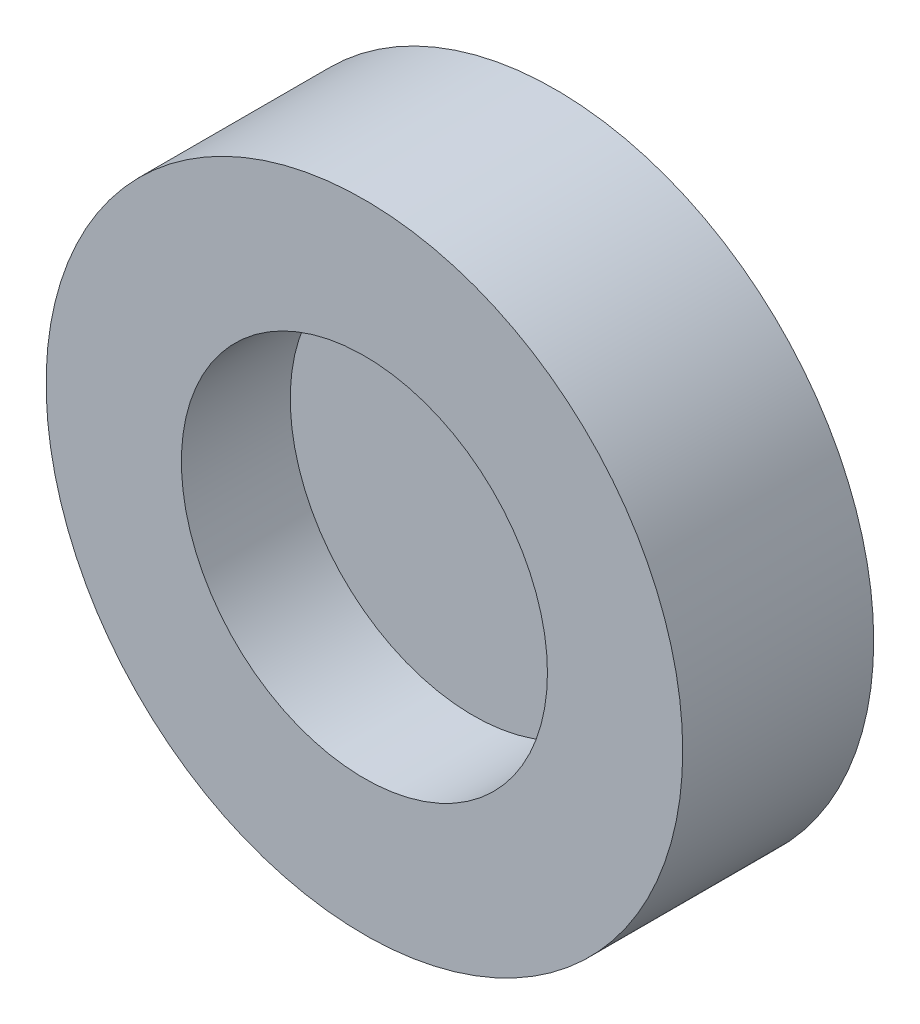
ISO-10303-21;
HEADER;
FILE_DESCRIPTION(('STEP AP214'),'2;1');
FILE_NAME('part.step','',(''),(''),'','','');
FILE_SCHEMA(('AUTOMOTIVE_DESIGN { 1 0 10303 214 1 1 1 1 }'));
ENDSEC;
DATA;
#1=APPLICATION_CONTEXT('core data for automotive mechanical design processes');
#2=APPLICATION_PROTOCOL_DEFINITION('international standard','automotive_design',2000,#1);
#3=PRODUCT_CONTEXT('',#1,'mechanical');
#4=PRODUCT('Part','Part','',(#3));
#5=PRODUCT_RELATED_PRODUCT_CATEGORY('part','',(#4));
#6=PRODUCT_DEFINITION_FORMATION('','',#4);
#7=PRODUCT_DEFINITION_CONTEXT('part definition',#1,'design');
#8=PRODUCT_DEFINITION('design','',#6,#7);
#9=PRODUCT_DEFINITION_SHAPE('','',#8);
#10=(LENGTH_UNIT() NAMED_UNIT(*) SI_UNIT(.MILLI.,.METRE.));
#11=(NAMED_UNIT(*) PLANE_ANGLE_UNIT() SI_UNIT($,.RADIAN.));
#12=(NAMED_UNIT(*) SI_UNIT($,.STERADIAN.) SOLID_ANGLE_UNIT());
#13=UNCERTAINTY_MEASURE_WITH_UNIT(LENGTH_MEASURE(1.E-05),#10,'distance_accuracy_value','');
#14=(GEOMETRIC_REPRESENTATION_CONTEXT(3) GLOBAL_UNCERTAINTY_ASSIGNED_CONTEXT((#13)) GLOBAL_UNIT_ASSIGNED_CONTEXT((#10,
#11,#12)) REPRESENTATION_CONTEXT('',''));
#15=CARTESIAN_POINT('',(0.,0.,0.));
#16=DIRECTION('',(0.,0.,1.));
#17=DIRECTION('',(1.,0.,0.));
#18=AXIS2_PLACEMENT_3D('',#15,#16,#17);
#19=CARTESIAN_POINT('',(-113.723326446448,27.9707840462604,-19.4388668796724));
#20=DIRECTION('',(0.,0.,1.));
#21=DIRECTION('',(1.,0.,0.));
#22=AXIS2_PLACEMENT_3D('',#19,#20,#21);
#23=CYLINDRICAL_SURFACE('',#22,9.99999999999999);
#24=CARTESIAN_POINT('',(-113.723326446448,27.9707840462604,-19.4388668796724));
#25=DIRECTION('',(0.,0.,-1.));
#26=DIRECTION('',(-1.,0.,0.));
#27=AXIS2_PLACEMENT_3D('',#24,#25,#26);
#28=CIRCLE('',#27,9.99999999999999);
#29=CARTESIAN_POINT('',(-103.723326446448,27.9707840462604,-19.4388668796724));
#30=VERTEX_POINT('',#29);
#31=EDGE_CURVE('E10',#30,#30,#28,.T.);
#32=CARTESIAN_POINT('',(-113.723326446448,27.9707840462604,-13.4388668796724));
#33=DIRECTION('',(0.,0.,-1.));
#34=DIRECTION('',(-1.,0.,0.));
#35=AXIS2_PLACEMENT_3D('',#32,#33,#34);
#36=CIRCLE('',#35,9.99999999999999);
#37=CARTESIAN_POINT('',(-103.723326446448,27.9707840462604,-13.4388668796724));
#38=VERTEX_POINT('',#37);
#39=EDGE_CURVE('E40',#38,#38,#36,.T.);
#40=CARTESIAN_POINT('',(-103.723326446448,27.9707840462604,-19.4388668796724));
#41=CARTESIAN_POINT('',(-103.723326446448,27.9707840462604,-19.3763668796724));
#42=CARTESIAN_POINT('',(-103.723326446448,27.9707840462604,-19.3138668796724));
#43=CARTESIAN_POINT('',(-103.723326446448,27.9707840462604,-19.1888668796724));
#44=CARTESIAN_POINT('',(-103.723326446448,27.9707840462604,-19.1263668796724));
#45=CARTESIAN_POINT('',(-103.723326446448,27.9707840462604,-19.0013668796724));
#46=CARTESIAN_POINT('',(-103.723326446448,27.9707840462604,-18.9388668796724));
#47=CARTESIAN_POINT('',(-103.723326446448,27.9707840462604,-18.8138668796724));
#48=CARTESIAN_POINT('',(-103.723326446448,27.9707840462604,-18.7513668796724));
#49=CARTESIAN_POINT('',(-103.723326446448,27.9707840462604,-18.6263668796724));
#50=CARTESIAN_POINT('',(-103.723326446448,27.9707840462604,-18.5638668796724));
#51=CARTESIAN_POINT('',(-103.723326446448,27.9707840462604,-18.4388668796724));
#52=CARTESIAN_POINT('',(-103.723326446448,27.9707840462604,-18.3763668796724));
#53=CARTESIAN_POINT('',(-103.723326446448,27.9707840462604,-18.2513668796724));
#54=CARTESIAN_POINT('',(-103.723326446448,27.9707840462604,-18.1888668796724));
#55=CARTESIAN_POINT('',(-103.723326446448,27.9707840462604,-18.0638668796724));
#56=CARTESIAN_POINT('',(-103.723326446448,27.9707840462604,-18.0013668796724));
#57=CARTESIAN_POINT('',(-103.723326446448,27.9707840462604,-17.8763668796724));
#58=CARTESIAN_POINT('',(-103.723326446448,27.9707840462604,-17.8138668796724));
#59=CARTESIAN_POINT('',(-103.723326446448,27.9707840462604,-17.6888668796724));
#60=CARTESIAN_POINT('',(-103.723326446448,27.9707840462604,-17.6263668796724));
#61=CARTESIAN_POINT('',(-103.723326446448,27.9707840462604,-17.5013668796724));
#62=CARTESIAN_POINT('',(-103.723326446448,27.9707840462604,-17.4388668796724));
#63=CARTESIAN_POINT('',(-103.723326446448,27.9707840462604,-17.3138668796724));
#64=CARTESIAN_POINT('',(-103.723326446448,27.9707840462604,-17.2513668796724));
#65=CARTESIAN_POINT('',(-103.723326446448,27.9707840462604,-17.1263668796724));
#66=CARTESIAN_POINT('',(-103.723326446448,27.9707840462604,-17.0638668796724));
#67=CARTESIAN_POINT('',(-103.723326446448,27.9707840462604,-16.9388668796724));
#68=CARTESIAN_POINT('',(-103.723326446448,27.9707840462604,-16.8763668796724));
#69=CARTESIAN_POINT('',(-103.723326446448,27.9707840462604,-16.7513668796724));
#70=CARTESIAN_POINT('',(-103.723326446448,27.9707840462604,-16.6888668796724));
#71=CARTESIAN_POINT('',(-103.723326446448,27.9707840462604,-16.5638668796724));
#72=CARTESIAN_POINT('',(-103.723326446448,27.9707840462604,-16.5013668796724));
#73=CARTESIAN_POINT('',(-103.723326446448,27.9707840462604,-16.3763668796724));
#74=CARTESIAN_POINT('',(-103.723326446448,27.9707840462604,-16.3138668796724));
#75=CARTESIAN_POINT('',(-103.723326446448,27.9707840462604,-16.1888668796724));
#76=CARTESIAN_POINT('',(-103.723326446448,27.9707840462604,-16.1263668796724));
#77=CARTESIAN_POINT('',(-103.723326446448,27.9707840462604,-16.0013668796724));
#78=CARTESIAN_POINT('',(-103.723326446448,27.9707840462604,-15.9388668796724));
#79=CARTESIAN_POINT('',(-103.723326446448,27.9707840462604,-15.8138668796724));
#80=CARTESIAN_POINT('',(-103.723326446448,27.9707840462604,-15.7513668796724));
#81=CARTESIAN_POINT('',(-103.723326446448,27.9707840462604,-15.6263668796724));
#82=CARTESIAN_POINT('',(-103.723326446448,27.9707840462604,-15.5638668796724));
#83=CARTESIAN_POINT('',(-103.723326446448,27.9707840462604,-15.4388668796724));
#84=CARTESIAN_POINT('',(-103.723326446448,27.9707840462604,-15.3763668796724));
#85=CARTESIAN_POINT('',(-103.723326446448,27.9707840462604,-15.2513668796724));
#86=CARTESIAN_POINT('',(-103.723326446448,27.9707840462604,-15.1888668796724));
#87=CARTESIAN_POINT('',(-103.723326446448,27.9707840462604,-15.0638668796724));
#88=CARTESIAN_POINT('',(-103.723326446448,27.9707840462604,-15.0013668796724));
#89=CARTESIAN_POINT('',(-103.723326446448,27.9707840462604,-14.8763668796724));
#90=CARTESIAN_POINT('',(-103.723326446448,27.9707840462604,-14.8138668796724));
#91=CARTESIAN_POINT('',(-103.723326446448,27.9707840462604,-14.6888668796724));
#92=CARTESIAN_POINT('',(-103.723326446448,27.9707840462604,-14.6263668796724));
#93=CARTESIAN_POINT('',(-103.723326446448,27.9707840462604,-14.5013668796724));
#94=CARTESIAN_POINT('',(-103.723326446448,27.9707840462604,-14.4388668796724));
#95=CARTESIAN_POINT('',(-103.723326446448,27.9707840462604,-14.3138668796724));
#96=CARTESIAN_POINT('',(-103.723326446448,27.9707840462604,-14.2513668796724));
#97=CARTESIAN_POINT('',(-103.723326446448,27.9707840462604,-14.1263668796724));
#98=CARTESIAN_POINT('',(-103.723326446448,27.9707840462604,-14.0638668796724));
#99=CARTESIAN_POINT('',(-103.723326446448,27.9707840462604,-13.9388668796724));
#100=CARTESIAN_POINT('',(-103.723326446448,27.9707840462604,-13.8763668796724));
#101=CARTESIAN_POINT('',(-103.723326446448,27.9707840462604,-13.7513668796724));
#102=CARTESIAN_POINT('',(-103.723326446448,27.9707840462604,-13.6888668796724));
#103=CARTESIAN_POINT('',(-103.723326446448,27.9707840462604,-13.5638668796724));
#104=CARTESIAN_POINT('',(-103.723326446448,27.9707840462604,-13.5013668796724));
#105=CARTESIAN_POINT('',(-103.723326446448,27.9707840462604,-13.4388668796724));
#106=B_SPLINE_CURVE_WITH_KNOTS('',3,(#40,#41,#42,#43,#44,#45,#46,#47,#48,#49,#50,#51,#52,#53,
#54,#55,#56,#57,#58,#59,#60,#61,#62,#63,#64,#65,#66,#67,#68,#69,#70,#71,#72,#73,#74,#75,#76,#77,
#78,#79,#80,#81,#82,#83,#84,#85,#86,#87,#88,#89,#90,#91,#92,#93,#94,#95,#96,#97,#98,#99,#100,
#101,#102,#103,#104,#105),.UNSPECIFIED.,.F.,.F.,(4,2,2,2,2,2,2,2,2,2,2,2,2,2,2,2,2,2,2,2,2,2,2,
2,2,2,2,2,2,2,2,2,4),(0.,0.1875,0.375,0.5625,0.750000000000001,0.937500000000001,1.125,1.3125,
1.5,1.6875,1.875,2.0625,2.25,2.4375,2.625,2.8125,3.,3.1875,3.375,3.5625,3.75,3.9375,4.125,
4.3125,4.5,4.6875,4.875,5.0625,5.25,5.4375,5.625,5.8125,6.),.UNSPECIFIED.);
#107=EDGE_CURVE('BSEAM37',#30,#38,#106,.T.);
#108=ORIENTED_EDGE('',*,*,#31,.F.);
#109=ORIENTED_EDGE('',*,*,#39,.T.);
#110=ORIENTED_EDGE('',*,*,#107,.T.);
#111=ORIENTED_EDGE('',*,*,#107,.F.);
#112=EDGE_LOOP('',(#108,#110,#109,#111));
#113=FACE_BOUND('',#112,.T.);
#114=ADVANCED_FACE('F37',(#113),#23,.T.);
#115=CARTESIAN_POINT('',(-113.723326446448,27.9707840462604,-19.4388668796724));
#116=DIRECTION('',(0.,0.,-1.));
#117=DIRECTION('',(-1.,0.,0.));
#118=AXIS2_PLACEMENT_3D('',#115,#116,#117);
#119=PLANE('',#118);
#120=ORIENTED_EDGE('',*,*,#31,.T.);
#121=EDGE_LOOP('',(#120));
#122=FACE_BOUND('',#121,.T.);
#123=ADVANCED_FACE('F66',(#122),#119,.T.);
#124=CARTESIAN_POINT('',(-113.723326446448,27.9707840462604,-13.4388668796724));
#125=DIRECTION('',(0.,0.,-1.));
#126=DIRECTION('',(-1.,0.,0.));
#127=AXIS2_PLACEMENT_3D('',#124,#125,#126);
#128=PLANE('',#127);
#129=CARTESIAN_POINT('',(-113.723326446448,27.9707840462604,-13.4388668796724));
#130=DIRECTION('',(0.,0.,1.));
#131=DIRECTION('',(1.,0.,0.));
#132=AXIS2_PLACEMENT_3D('',#129,#130,#131);
#133=CIRCLE('',#132,5.75);
#134=CARTESIAN_POINT('',(-107.973326446448,27.9707840462604,-13.4388668796724));
#135=VERTEX_POINT('',#134);
#136=EDGE_CURVE('E49',#135,#135,#133,.T.);
#137=ORIENTED_EDGE('',*,*,#136,.F.);
#138=EDGE_LOOP('',(#137));
#139=FACE_BOUND('',#138,.T.);
#140=ORIENTED_EDGE('',*,*,#39,.F.);
#141=EDGE_LOOP('',(#140));
#142=FACE_BOUND('',#141,.T.);
#143=ADVANCED_FACE('F60',(#139,#142),#128,.F.);
#144=CARTESIAN_POINT('',(-113.723326446448,27.9707840462604,-16.8588668796724));
#145=DIRECTION('',(0.,0.,1.));
#146=DIRECTION('',(1.,0.,0.));
#147=AXIS2_PLACEMENT_3D('',#144,#145,#146);
#148=CYLINDRICAL_SURFACE('',#147,5.75);
#149=CARTESIAN_POINT('',(-113.723326446448,27.9707840462604,-16.8588668796724));
#150=DIRECTION('',(0.,0.,1.));
#151=DIRECTION('',(1.,0.,0.));
#152=AXIS2_PLACEMENT_3D('',#149,#150,#151);
#153=CIRCLE('',#152,5.75);
#154=CARTESIAN_POINT('',(-107.973326446448,27.9707840462604,-16.8588668796724));
#155=VERTEX_POINT('',#154);
#156=EDGE_CURVE('E47',#155,#155,#153,.T.);
#157=ORIENTED_EDGE('',*,*,#156,.F.);
#158=EDGE_LOOP('',(#157));
#159=FACE_BOUND('',#158,.T.);
#160=ORIENTED_EDGE('',*,*,#136,.T.);
#161=EDGE_LOOP('',(#160));
#162=FACE_BOUND('',#161,.T.);
#163=ADVANCED_FACE('F57',(#159,#162),#148,.F.);
#164=CARTESIAN_POINT('',(-113.723326446448,27.9707840462604,-16.8588668796724));
#165=DIRECTION('',(0.,0.,1.));
#166=DIRECTION('',(1.,0.,0.));
#167=AXIS2_PLACEMENT_3D('',#164,#165,#166);
#168=PLANE('',#167);
#169=ORIENTED_EDGE('',*,*,#156,.T.);
#170=EDGE_LOOP('',(#169));
#171=FACE_BOUND('',#170,.T.);
#172=ADVANCED_FACE('F55',(#171),#168,.T.);
#173=CLOSED_SHELL('',(#114,#123,#143,#163,#172));
#174=MANIFOLD_SOLID_BREP('B2',#173);
#175=ADVANCED_BREP_SHAPE_REPRESENTATION('',(#18,#174),#14);
#176=SHAPE_DEFINITION_REPRESENTATION(#9,#175);
ENDSEC;
END-ISO-10303-21;
